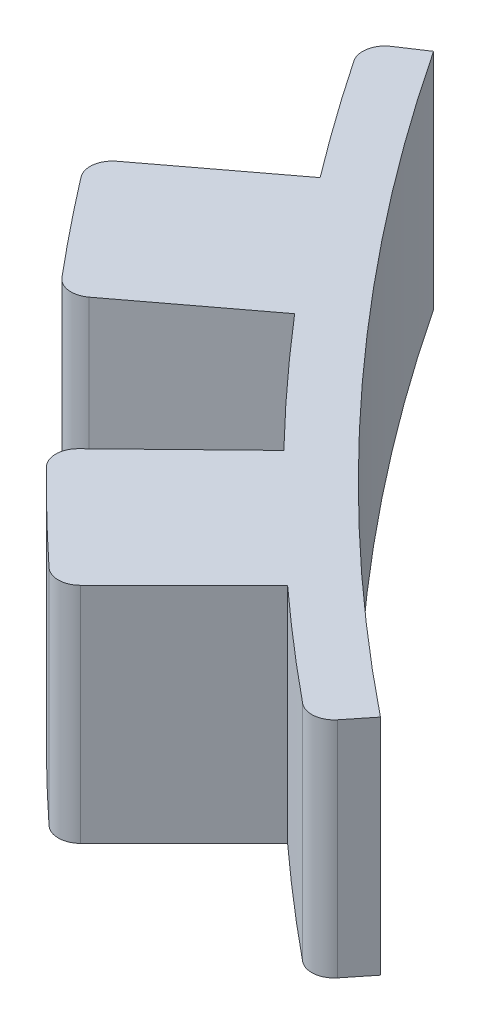
ISO-10303-21;
HEADER;
FILE_DESCRIPTION(('STEP AP214'),'2;1');
FILE_NAME('part.step','',(''),(''),'','','');
FILE_SCHEMA(('AUTOMOTIVE_DESIGN { 1 0 10303 214 1 1 1 1 }'));
ENDSEC;
DATA;
#1=APPLICATION_CONTEXT('core data for automotive mechanical design processes');
#2=APPLICATION_PROTOCOL_DEFINITION('international standard','automotive_design',2000,#1);
#3=PRODUCT_CONTEXT('',#1,'mechanical');
#4=PRODUCT('Part','Part','',(#3));
#5=PRODUCT_RELATED_PRODUCT_CATEGORY('part','',(#4));
#6=PRODUCT_DEFINITION_FORMATION('','',#4);
#7=PRODUCT_DEFINITION_CONTEXT('part definition',#1,'design');
#8=PRODUCT_DEFINITION('design','',#6,#7);
#9=PRODUCT_DEFINITION_SHAPE('','',#8);
#10=(LENGTH_UNIT() NAMED_UNIT(*) SI_UNIT(.MILLI.,.METRE.));
#11=(NAMED_UNIT(*) PLANE_ANGLE_UNIT() SI_UNIT($,.RADIAN.));
#12=(NAMED_UNIT(*) SI_UNIT($,.STERADIAN.) SOLID_ANGLE_UNIT());
#13=UNCERTAINTY_MEASURE_WITH_UNIT(LENGTH_MEASURE(1.E-05),#10,'distance_accuracy_value','');
#14=(GEOMETRIC_REPRESENTATION_CONTEXT(3) GLOBAL_UNCERTAINTY_ASSIGNED_CONTEXT((#13)) GLOBAL_UNIT_ASSIGNED_CONTEXT((#10,
#11,#12)) REPRESENTATION_CONTEXT('',''));
#15=CARTESIAN_POINT('',(0.,0.,0.));
#16=DIRECTION('',(0.,0.,1.));
#17=DIRECTION('',(1.,0.,0.));
#18=AXIS2_PLACEMENT_3D('',#15,#16,#17);
#19=CARTESIAN_POINT('',(-6.27966514113583E-13,25.4,-9.49027582190324E-13));
#20=DIRECTION('',(-0.551826294431821,0.,-0.833959076198374));
#21=DIRECTION('',(-0.833959076198374,0.,0.551826294431821));
#22=AXIS2_PLACEMENT_3D('',#19,#20,#21);
#23=PLANE('',#22);
#24=DIRECTION('',(0.833959076198374,0.,-0.551826294431821));
#25=VECTOR('',#24,1.);
#26=CARTESIAN_POINT('',(-6.27966514113583E-13,0.,-9.49027582190324E-13));
#27=LINE('',#26,#25);
#28=CARTESIAN_POINT('',(-253.722297459853,0.,167.88669758262));
#29=VERTEX_POINT('',#28);
#30=CARTESIAN_POINT('',(-250.832740903124,0.,165.97469334553));
#31=VERTEX_POINT('',#30);
#32=EDGE_CURVE('E211',#29,#31,#27,.T.);
#33=ORIENTED_EDGE('',*,*,#32,.F.);
#34=DIRECTION('',(0.,1.,0.));
#35=VECTOR('',#34,1.);
#36=CARTESIAN_POINT('',(-253.722297459853,25.4,167.88669758262));
#37=LINE('',#36,#35);
#38=CARTESIAN_POINT('',(-253.722297459853,25.4,167.88669758262));
#39=VERTEX_POINT('',#38);
#40=EDGE_CURVE('E11',#29,#39,#37,.T.);
#41=ORIENTED_EDGE('',*,*,#40,.T.);
#42=DIRECTION('',(0.833959076198374,0.,-0.551826294431821));
#43=VECTOR('',#42,1.);
#44=CARTESIAN_POINT('',(-6.27966514113583E-13,25.4,-9.49027582190324E-13));
#45=LINE('',#44,#43);
#46=CARTESIAN_POINT('',(-250.832740903124,25.4,165.97469334553));
#47=VERTEX_POINT('',#46);
#48=EDGE_CURVE('E170',#39,#47,#45,.T.);
#49=ORIENTED_EDGE('',*,*,#48,.T.);
#50=DIRECTION('',(0.,-1.,0.));
#51=VECTOR('',#50,1.);
#52=CARTESIAN_POINT('',(-250.832740903124,25.4,165.97469334553));
#53=LINE('',#52,#51);
#54=EDGE_CURVE('E210',#47,#31,#53,.T.);
#55=ORIENTED_EDGE('',*,*,#54,.T.);
#56=EDGE_LOOP('',(#33,#41,#49,#55));
#57=FACE_BOUND('',#56,.T.);
#58=ADVANCED_FACE('F32',(#57),#23,.T.);
#59=CARTESIAN_POINT('',(0.,25.4,0.));
#60=DIRECTION('',(0.,-1.,0.));
#61=DIRECTION('',(0.,0.,-1.));
#62=AXIS2_PLACEMENT_3D('',#59,#60,#61);
#63=CYLINDRICAL_SURFACE('',#62,306.788909699779);
#64=CARTESIAN_POINT('',(0.,25.4,0.));
#65=DIRECTION('',(0.,1.,0.));
#66=DIRECTION('',(0.,0.,1.));
#67=AXIS2_PLACEMENT_3D('',#64,#65,#66);
#68=CIRCLE('',#67,306.788909699779);
#69=CARTESIAN_POINT('',(-254.427139427044,25.4,171.424227686027));
#70=VERTEX_POINT('',#69);
#71=CARTESIAN_POINT('',(-244.848924973959,25.4,184.847069367832));
#72=VERTEX_POINT('',#71);
#73=EDGE_CURVE('E157',#70,#72,#68,.T.);
#74=ORIENTED_EDGE('',*,*,#73,.F.);
#75=DIRECTION('',(0.,-1.,0.));
#76=VECTOR('',#75,1.);
#77=CARTESIAN_POINT('',(-254.427139427044,25.4,171.424227686027));
#78=LINE('',#77,#76);
#79=CARTESIAN_POINT('',(-254.427139427044,0.,171.424227686027));
#80=VERTEX_POINT('',#79);
#81=EDGE_CURVE('E40',#70,#80,#78,.T.);
#82=ORIENTED_EDGE('',*,*,#81,.T.);
#83=CARTESIAN_POINT('',(0.,0.,0.));
#84=DIRECTION('',(0.,1.,0.));
#85=DIRECTION('',(0.,0.,1.));
#86=AXIS2_PLACEMENT_3D('',#83,#84,#85);
#87=CIRCLE('',#86,306.788909699779);
#88=CARTESIAN_POINT('',(-244.848924973959,0.,184.847069367832));
#89=VERTEX_POINT('',#88);
#90=EDGE_CURVE('E176',#80,#89,#87,.T.);
#91=ORIENTED_EDGE('',*,*,#90,.T.);
#92=DIRECTION('',(0.,-1.,0.));
#93=VECTOR('',#92,1.);
#94=CARTESIAN_POINT('',(-244.848924973959,25.4,184.847069367832));
#95=LINE('',#94,#93);
#96=EDGE_CURVE('E173',#72,#89,#95,.T.);
#97=ORIENTED_EDGE('',*,*,#96,.F.);
#98=EDGE_LOOP('',(#74,#82,#91,#97));
#99=FACE_BOUND('',#98,.T.);
#100=ADVANCED_FACE('F174',(#99),#63,.T.);
#101=CARTESIAN_POINT('',(0.,25.4,0.));
#102=DIRECTION('',(0.602522006250881,0.,0.798102269125589));
#103=DIRECTION('',(0.798102269125589,0.,-0.602522006250881));
#104=AXIS2_PLACEMENT_3D('',#101,#102,#103);
#105=PLANE('',#104);
#106=DIRECTION('',(-0.798102269125589,0.,0.602522006250881));
#107=VECTOR('',#106,1.);
#108=CARTESIAN_POINT('',(0.,0.,0.));
#109=LINE('',#108,#107);
#110=CARTESIAN_POINT('',(-258.016819612122,0.,194.788083950059));
#111=VERTEX_POINT('',#110);
#112=EDGE_CURVE('E214',#89,#111,#109,.T.);
#113=ORIENTED_EDGE('',*,*,#112,.T.);
#114=DIRECTION('',(0.,-1.,0.));
#115=VECTOR('',#114,1.);
#116=CARTESIAN_POINT('',(-258.016819612122,25.4,194.788083950059));
#117=LINE('',#116,#115);
#118=CARTESIAN_POINT('',(-258.016819612122,25.4,194.788083950059));
#119=VERTEX_POINT('',#118);
#120=EDGE_CURVE('E185',#111,#119,#117,.F.);
#121=ORIENTED_EDGE('',*,*,#120,.T.);
#122=DIRECTION('',(-0.798102269125589,0.,0.602522006250881));
#123=VECTOR('',#122,1.);
#124=CARTESIAN_POINT('',(0.,25.4,0.));
#125=LINE('',#124,#123);
#126=EDGE_CURVE('E162',#72,#119,#125,.T.);
#127=ORIENTED_EDGE('',*,*,#126,.F.);
#128=ORIENTED_EDGE('',*,*,#96,.T.);
#129=EDGE_LOOP('',(#113,#121,#127,#128));
#130=FACE_BOUND('',#129,.T.);
#131=ADVANCED_FACE('F183',(#130),#105,.F.);
#132=CARTESIAN_POINT('',(0.,25.4,0.));
#133=DIRECTION('',(0.,-1.,0.));
#134=DIRECTION('',(0.,0.,-1.));
#135=AXIS2_PLACEMENT_3D('',#132,#133,#134);
#136=CYLINDRICAL_SURFACE('',#135,325.837894288981);
#137=CARTESIAN_POINT('',(0.,0.,0.));
#138=DIRECTION('',(0.,1.,0.));
#139=DIRECTION('',(0.,0.,1.));
#140=AXIS2_PLACEMENT_3D('',#137,#138,#139);
#141=CIRCLE('',#140,325.837894288981);
#142=CARTESIAN_POINT('',(-258.501507233238,0.,198.361548977673));
#143=VERTEX_POINT('',#142);
#144=CARTESIAN_POINT('',(-249.693891681859,0.,209.340139035603));
#145=VERTEX_POINT('',#144);
#146=EDGE_CURVE('E216',#143,#145,#141,.T.);
#147=ORIENTED_EDGE('',*,*,#146,.T.);
#148=DIRECTION('',(0.,-1.,0.));
#149=VECTOR('',#148,1.);
#150=CARTESIAN_POINT('',(-249.693891681859,25.4,209.340139035603));
#151=LINE('',#150,#149);
#152=CARTESIAN_POINT('',(-249.693891681859,25.4,209.340139035603));
#153=VERTEX_POINT('',#152);
#154=EDGE_CURVE('E292',#145,#153,#151,.F.);
#155=ORIENTED_EDGE('',*,*,#154,.T.);
#156=CARTESIAN_POINT('',(0.,25.4,0.));
#157=DIRECTION('',(0.,1.,0.));
#158=DIRECTION('',(0.,0.,1.));
#159=AXIS2_PLACEMENT_3D('',#156,#157,#158);
#160=CIRCLE('',#159,325.837894288981);
#161=CARTESIAN_POINT('',(-258.501507233238,25.4,198.361548977673));
#162=VERTEX_POINT('',#161);
#163=EDGE_CURVE('E186',#162,#153,#160,.T.);
#164=ORIENTED_EDGE('',*,*,#163,.F.);
#165=DIRECTION('',(0.,-1.,0.));
#166=VECTOR('',#165,1.);
#167=CARTESIAN_POINT('',(-258.501507233238,25.4,198.361548977673));
#168=LINE('',#167,#166);
#169=EDGE_CURVE('E289',#162,#143,#168,.T.);
#170=ORIENTED_EDGE('',*,*,#169,.T.);
#171=EDGE_LOOP('',(#147,#155,#164,#170));
#172=FACE_BOUND('',#171,.T.);
#173=ADVANCED_FACE('F306',(#172),#136,.T.);
#174=CARTESIAN_POINT('',(11.4715064556953,25.4,15.1951882878898));
#175=DIRECTION('',(-0.602522006250881,0.,-0.798102269125589));
#176=DIRECTION('',(-0.798102269125589,0.,0.602522006250881));
#177=AXIS2_PLACEMENT_3D('',#174,#175,#176);
#178=PLANE('',#177);
#179=DIRECTION('',(0.798102269125589,0.,-0.602522006250881));
#180=VECTOR('',#179,1.);
#181=CARTESIAN_POINT('',(11.4715064556953,25.4,15.1951882878898));
#182=LINE('',#181,#180);
#183=CARTESIAN_POINT('',(-246.217050162661,25.4,209.735452271469));
#184=VERTEX_POINT('',#183);
#185=CARTESIAN_POINT('',(-232.9054611861,25.4,199.685956603036));
#186=VERTEX_POINT('',#185);
#187=EDGE_CURVE('E189',#184,#186,#182,.T.);
#188=ORIENTED_EDGE('',*,*,#187,.F.);
#189=DIRECTION('',(0.,-1.,0.));
#190=VECTOR('',#189,1.);
#191=CARTESIAN_POINT('',(-246.217050162661,25.4,209.735452271469));
#192=LINE('',#191,#190);
#193=CARTESIAN_POINT('',(-246.217050162661,0.,209.735452271469));
#194=VERTEX_POINT('',#193);
#195=EDGE_CURVE('E286',#184,#194,#192,.T.);
#196=ORIENTED_EDGE('',*,*,#195,.T.);
#197=DIRECTION('',(0.798102269125589,0.,-0.602522006250881));
#198=VECTOR('',#197,1.);
#199=CARTESIAN_POINT('',(11.4715064556953,0.,15.1951882878898));
#200=LINE('',#199,#198);
#201=CARTESIAN_POINT('',(-232.9054611861,0.,199.685956603036));
#202=VERTEX_POINT('',#201);
#203=EDGE_CURVE('E219',#194,#202,#200,.T.);
#204=ORIENTED_EDGE('',*,*,#203,.T.);
#205=DIRECTION('',(0.,-1.,0.));
#206=VECTOR('',#205,1.);
#207=CARTESIAN_POINT('',(-232.9054611861,25.4,199.685956603036));
#208=LINE('',#207,#206);
#209=EDGE_CURVE('E181',#186,#202,#208,.T.);
#210=ORIENTED_EDGE('',*,*,#209,.F.);
#211=EDGE_LOOP('',(#188,#196,#204,#210));
#212=FACE_BOUND('',#211,.T.);
#213=ADVANCED_FACE('F314',(#212),#178,.F.);
#214=CARTESIAN_POINT('',(0.,25.4,0.));
#215=DIRECTION('',(0.,-1.,0.));
#216=DIRECTION('',(0.,0.,-1.));
#217=AXIS2_PLACEMENT_3D('',#214,#215,#216);
#218=CYLINDRICAL_SURFACE('',#217,306.788909699779);
#219=CARTESIAN_POINT('',(0.,0.,0.));
#220=DIRECTION('',(0.,1.,0.));
#221=DIRECTION('',(0.,0.,1.));
#222=AXIS2_PLACEMENT_3D('',#219,#220,#221);
#223=CIRCLE('',#222,306.788909699779);
#224=CARTESIAN_POINT('',(-220.065095537838,0.,213.754038185719));
#225=VERTEX_POINT('',#224);
#226=EDGE_CURVE('E221',#202,#225,#223,.T.);
#227=ORIENTED_EDGE('',*,*,#226,.T.);
#228=DIRECTION('',(0.,-1.,0.));
#229=VECTOR('',#228,1.);
#230=CARTESIAN_POINT('',(-220.065095537838,25.4,213.754038185719));
#231=LINE('',#230,#229);
#232=CARTESIAN_POINT('',(-220.065095537838,25.4,213.754038185719));
#233=VERTEX_POINT('',#232);
#234=EDGE_CURVE('E246',#233,#225,#231,.T.);
#235=ORIENTED_EDGE('',*,*,#234,.F.);
#236=CARTESIAN_POINT('',(0.,25.4,0.));
#237=DIRECTION('',(0.,1.,0.));
#238=DIRECTION('',(0.,0.,1.));
#239=AXIS2_PLACEMENT_3D('',#236,#237,#238);
#240=CIRCLE('',#239,306.788909699779);
#241=EDGE_CURVE('E194',#186,#233,#240,.T.);
#242=ORIENTED_EDGE('',*,*,#241,.F.);
#243=ORIENTED_EDGE('',*,*,#209,.T.);
#244=EDGE_LOOP('',(#227,#235,#242,#243));
#245=FACE_BOUND('',#244,.T.);
#246=ADVANCED_FACE('F320',(#245),#218,.T.);
#247=CARTESIAN_POINT('',(-1.74047351914841E-13,25.4,-1.79186075043732E-13));
#248=DIRECTION('',(0.696746301536442,0.,0.717317636263942));
#249=DIRECTION('',(0.717317636263942,0.,-0.696746301536442));
#250=AXIS2_PLACEMENT_3D('',#247,#248,#249);
#251=PLANE('',#250);
#252=DIRECTION('',(-0.717317636263942,0.,0.696746301536442));
#253=VECTOR('',#252,1.);
#254=CARTESIAN_POINT('',(-1.74047351914841E-13,0.,-1.79186075043732E-13));
#255=LINE('',#254,#253);
#256=CARTESIAN_POINT('',(-231.90012398196,0.,225.249660041566));
#257=VERTEX_POINT('',#256);
#258=EDGE_CURVE('E223',#225,#257,#255,.T.);
#259=ORIENTED_EDGE('',*,*,#258,.T.);
#260=DIRECTION('',(0.,-1.,0.));
#261=VECTOR('',#260,1.);
#262=CARTESIAN_POINT('',(-231.90012398196,25.4,225.249660041566));
#263=LINE('',#262,#261);
#264=CARTESIAN_POINT('',(-231.90012398196,25.4,225.249660041566));
#265=VERTEX_POINT('',#264);
#266=EDGE_CURVE('E284',#257,#265,#263,.F.);
#267=ORIENTED_EDGE('',*,*,#266,.T.);
#268=DIRECTION('',(-0.717317636263942,0.,0.696746301536442));
#269=VECTOR('',#268,1.);
#270=CARTESIAN_POINT('',(-1.74047351914841E-13,25.4,-1.79186075043732E-13));
#271=LINE('',#270,#269);
#272=EDGE_CURVE('E196',#233,#265,#271,.T.);
#273=ORIENTED_EDGE('',*,*,#272,.F.);
#274=ORIENTED_EDGE('',*,*,#234,.T.);
#275=EDGE_LOOP('',(#259,#267,#273,#274));
#276=FACE_BOUND('',#275,.T.);
#277=ADVANCED_FACE('F462',(#276),#251,.F.);
#278=CARTESIAN_POINT('',(0.,25.4,0.));
#279=DIRECTION('',(0.,-1.,0.));
#280=DIRECTION('',(0.,0.,-1.));
#281=AXIS2_PLACEMENT_3D('',#278,#279,#280);
#282=CYLINDRICAL_SURFACE('',#281,325.837894288981);
#283=CARTESIAN_POINT('',(0.,0.,0.));
#284=DIRECTION('',(0.,1.,0.));
#285=DIRECTION('',(0.,0.,1.));
#286=AXIS2_PLACEMENT_3D('',#283,#284,#285);
#287=CIRCLE('',#286,325.837894288981);
#288=CARTESIAN_POINT('',(-231.938414957117,0.,228.855642320345));
#289=VERTEX_POINT('',#288);
#290=CARTESIAN_POINT('',(-221.864697377229,0.,238.634426293417));
#291=VERTEX_POINT('',#290);
#292=EDGE_CURVE('E226',#289,#291,#287,.T.);
#293=ORIENTED_EDGE('',*,*,#292,.T.);
#294=DIRECTION('',(0.,-1.,0.));
#295=VECTOR('',#294,1.);
#296=CARTESIAN_POINT('',(-221.864697377229,25.4,238.634426293417));
#297=LINE('',#296,#295);
#298=CARTESIAN_POINT('',(-221.864697377229,25.4,238.634426293417));
#299=VERTEX_POINT('',#298);
#300=EDGE_CURVE('E55',#291,#299,#297,.F.);
#301=ORIENTED_EDGE('',*,*,#300,.T.);
#302=CARTESIAN_POINT('',(0.,25.4,0.));
#303=DIRECTION('',(0.,1.,0.));
#304=DIRECTION('',(0.,0.,1.));
#305=AXIS2_PLACEMENT_3D('',#302,#303,#304);
#306=CIRCLE('',#305,325.837894288981);
#307=CARTESIAN_POINT('',(-231.938414957117,25.4,228.855642320345));
#308=VERTEX_POINT('',#307);
#309=EDGE_CURVE('E199',#308,#299,#306,.T.);
#310=ORIENTED_EDGE('',*,*,#309,.F.);
#311=DIRECTION('',(0.,-1.,0.));
#312=VECTOR('',#311,1.);
#313=CARTESIAN_POINT('',(-231.938414957117,25.4,228.855642320345));
#314=LINE('',#313,#312);
#315=EDGE_CURVE('E280',#308,#289,#314,.T.);
#316=ORIENTED_EDGE('',*,*,#315,.T.);
#317=EDGE_LOOP('',(#293,#301,#310,#316));
#318=FACE_BOUND('',#317,.T.);
#319=ADVANCED_FACE('F329',(#318),#282,.T.);
#320=CARTESIAN_POINT('',(10.1155532550883,25.4,10.1155532551089));
#321=DIRECTION('',(-0.707106781185825,0.,-0.70710678118727));
#322=DIRECTION('',(-0.70710678118727,0.,0.707106781185825));
#323=AXIS2_PLACEMENT_3D('',#320,#321,#322);
#324=PLANE('',#323);
#325=DIRECTION('',(0.70710678118727,0.,-0.707106781185825));
#326=VECTOR('',#325,1.);
#327=CARTESIAN_POINT('',(10.1155532550883,25.4,10.1155532551089));
#328=LINE('',#327,#326);
#329=CARTESIAN_POINT('',(-218.339147094695,25.4,238.570253604426));
#330=VERTEX_POINT('',#329);
#331=CARTESIAN_POINT('',(-206.580992956034,25.4,226.812099465788));
#332=VERTEX_POINT('',#331);
#333=EDGE_CURVE('E201',#330,#332,#328,.T.);
#334=ORIENTED_EDGE('',*,*,#333,.F.);
#335=DIRECTION('',(0.,-1.,0.));
#336=VECTOR('',#335,1.);
#337=CARTESIAN_POINT('',(-218.339147094695,25.4,238.570253604426));
#338=LINE('',#337,#336);
#339=CARTESIAN_POINT('',(-218.339147094695,0.,238.570253604426));
#340=VERTEX_POINT('',#339);
#341=EDGE_CURVE('E277',#330,#340,#338,.T.);
#342=ORIENTED_EDGE('',*,*,#341,.T.);
#343=DIRECTION('',(0.70710678118727,0.,-0.707106781185825));
#344=VECTOR('',#343,1.);
#345=CARTESIAN_POINT('',(10.1155532550883,0.,10.1155532551089));
#346=LINE('',#345,#344);
#347=CARTESIAN_POINT('',(-206.580992956034,0.,226.812099465788));
#348=VERTEX_POINT('',#347);
#349=EDGE_CURVE('E228',#340,#348,#346,.T.);
#350=ORIENTED_EDGE('',*,*,#349,.T.);
#351=DIRECTION('',(0.,-1.,0.));
#352=VECTOR('',#351,1.);
#353=CARTESIAN_POINT('',(-206.580992956034,25.4,226.812099465788));
#354=LINE('',#353,#352);
#355=EDGE_CURVE('E243',#332,#348,#354,.T.);
#356=ORIENTED_EDGE('',*,*,#355,.F.);
#357=EDGE_LOOP('',(#334,#342,#350,#356));
#358=FACE_BOUND('',#357,.T.);
#359=ADVANCED_FACE('F337',(#358),#324,.F.);
#360=CARTESIAN_POINT('',(0.,25.4,0.));
#361=DIRECTION('',(0.,-1.,0.));
#362=DIRECTION('',(0.,0.,-1.));
#363=AXIS2_PLACEMENT_3D('',#360,#361,#362);
#364=CYLINDRICAL_SURFACE('',#363,306.788909699779);
#365=CARTESIAN_POINT('',(0.,0.,0.));
#366=DIRECTION('',(0.,1.,0.));
#367=DIRECTION('',(0.,0.,1.));
#368=AXIS2_PLACEMENT_3D('',#365,#366,#367);
#369=CIRCLE('',#368,306.788909699779);
#370=CARTESIAN_POINT('',(-194.095881709627,0.,237.584140502143));
#371=VERTEX_POINT('',#370);
#372=EDGE_CURVE('E230',#348,#371,#369,.T.);
#373=ORIENTED_EDGE('',*,*,#372,.T.);
#374=DIRECTION('',(0.,-1.,0.));
#375=VECTOR('',#374,1.);
#376=CARTESIAN_POINT('',(-194.095881709627,25.4,237.584140502143));
#377=LINE('',#376,#375);
#378=CARTESIAN_POINT('',(-194.095881709627,25.4,237.584140502143));
#379=VERTEX_POINT('',#378);
#380=EDGE_CURVE('E265',#371,#379,#377,.F.);
#381=ORIENTED_EDGE('',*,*,#380,.T.);
#382=CARTESIAN_POINT('',(0.,25.4,0.));
#383=DIRECTION('',(0.,1.,0.));
#384=DIRECTION('',(0.,0.,1.));
#385=AXIS2_PLACEMENT_3D('',#382,#383,#384);
#386=CIRCLE('',#385,306.788909699779);
#387=EDGE_CURVE('E203',#332,#379,#386,.T.);
#388=ORIENTED_EDGE('',*,*,#387,.F.);
#389=ORIENTED_EDGE('',*,*,#355,.T.);
#390=EDGE_LOOP('',(#373,#381,#388,#389));
#391=FACE_BOUND('',#390,.T.);
#392=ADVANCED_FACE('F435',(#391),#364,.T.);
#393=CARTESIAN_POINT('',(0.,25.4,0.));
#394=DIRECTION('',(-0.779676998917513,0.,-0.626181904368834));
#395=DIRECTION('',(-0.626181904368834,0.,0.779676998917513));
#396=AXIS2_PLACEMENT_3D('',#393,#394,#395);
#397=PLANE('',#396);
#398=DIRECTION('',(0.626181904368834,0.,-0.779676998917513));
#399=VECTOR('',#398,1.);
#400=CARTESIAN_POINT('',(0.,25.4,0.));
#401=LINE('',#400,#399);
#402=CARTESIAN_POINT('',(-190.5085224667,25.4,237.207610166831));
#403=VERTEX_POINT('',#402);
#404=CARTESIAN_POINT('',(-188.338885995181,25.4,234.506133741126));
#405=VERTEX_POINT('',#404);
#406=EDGE_CURVE('E205',#403,#405,#401,.T.);
#407=ORIENTED_EDGE('',*,*,#406,.F.);
#408=DIRECTION('',(0.,-1.,0.));
#409=VECTOR('',#408,1.);
#410=CARTESIAN_POINT('',(-190.5085224667,25.4,237.207610166831));
#411=LINE('',#410,#409);
#412=CARTESIAN_POINT('',(-190.5085224667,0.,237.207610166831));
#413=VERTEX_POINT('',#412);
#414=EDGE_CURVE('E180',#403,#413,#411,.T.);
#415=ORIENTED_EDGE('',*,*,#414,.T.);
#416=DIRECTION('',(0.626181904368834,0.,-0.779676998917513));
#417=VECTOR('',#416,1.);
#418=CARTESIAN_POINT('',(0.,0.,0.));
#419=LINE('',#418,#417);
#420=CARTESIAN_POINT('',(-188.338885995181,0.,234.506133741126));
#421=VERTEX_POINT('',#420);
#422=EDGE_CURVE('E233',#413,#421,#419,.T.);
#423=ORIENTED_EDGE('',*,*,#422,.T.);
#424=DIRECTION('',(0.,-1.,0.));
#425=VECTOR('',#424,1.);
#426=CARTESIAN_POINT('',(-188.338885995181,25.4,234.506133741126));
#427=LINE('',#426,#425);
#428=EDGE_CURVE('E240',#405,#421,#427,.T.);
#429=ORIENTED_EDGE('',*,*,#428,.F.);
#430=EDGE_LOOP('',(#407,#415,#423,#429));
#431=FACE_BOUND('',#430,.T.);
#432=ADVANCED_FACE('F348',(#431),#397,.F.);
#433=CARTESIAN_POINT('',(0.,25.4,0.));
#434=DIRECTION('',(0.,-1.,0.));
#435=DIRECTION('',(0.,0.,-1.));
#436=AXIS2_PLACEMENT_3D('',#433,#434,#435);
#437=CYLINDRICAL_SURFACE('',#436,300.773440882198);
#438=CARTESIAN_POINT('',(0.,0.,0.));
#439=DIRECTION('',(0.,1.,0.));
#440=DIRECTION('',(0.,0.,1.));
#441=AXIS2_PLACEMENT_3D('',#438,#439,#440);
#442=CIRCLE('',#441,300.773440882198);
#443=EDGE_CURVE('E235',#31,#421,#442,.T.);
#444=ORIENTED_EDGE('',*,*,#443,.F.);
#445=ORIENTED_EDGE('',*,*,#54,.F.);
#446=CARTESIAN_POINT('',(0.,25.4,0.));
#447=DIRECTION('',(0.,1.,0.));
#448=DIRECTION('',(0.,0.,1.));
#449=AXIS2_PLACEMENT_3D('',#446,#447,#448);
#450=CIRCLE('',#449,300.773440882198);
#451=EDGE_CURVE('E207',#47,#405,#450,.T.);
#452=ORIENTED_EDGE('',*,*,#451,.T.);
#453=ORIENTED_EDGE('',*,*,#428,.T.);
#454=EDGE_LOOP('',(#444,#445,#452,#453));
#455=FACE_BOUND('',#454,.T.);
#456=ADVANCED_FACE('F353',(#455),#437,.F.);
#457=CARTESIAN_POINT('',(0.,25.4,0.));
#458=DIRECTION('',(0.,1.,0.));
#459=DIRECTION('',(0.,0.,1.));
#460=AXIS2_PLACEMENT_3D('',#457,#458,#459);
#461=PLANE('',#460);
#462=ORIENTED_EDGE('',*,*,#387,.T.);
#463=CARTESIAN_POINT('',(-192.488902043951,25.4,235.617108129734));
#464=DIRECTION('',(0.,1.,0.));
#465=DIRECTION('',(0.,0.,1.));
#466=AXIS2_PLACEMENT_3D('',#463,#464,#465);
#467=CIRCLE('',#466,2.54);
#468=EDGE_CURVE('E275',#379,#403,#467,.T.);
#469=ORIENTED_EDGE('',*,*,#468,.T.);
#470=ORIENTED_EDGE('',*,*,#406,.T.);
#471=ORIENTED_EDGE('',*,*,#451,.F.);
#472=ORIENTED_EDGE('',*,*,#48,.F.);
#473=CARTESIAN_POINT('',(-252.320658671997,25.4,170.004953636164));
#474=DIRECTION('',(0.,1.,0.));
#475=DIRECTION('',(0.,0.,1.));
#476=AXIS2_PLACEMENT_3D('',#473,#474,#475);
#477=CIRCLE('',#476,2.54);
#478=EDGE_CURVE('E166',#39,#70,#477,.T.);
#479=ORIENTED_EDGE('',*,*,#478,.T.);
#480=ORIENTED_EDGE('',*,*,#73,.T.);
#481=ORIENTED_EDGE('',*,*,#126,.T.);
#482=CARTESIAN_POINT('',(-256.486413716245,25.4,196.815263713638));
#483=DIRECTION('',(0.,1.,0.));
#484=DIRECTION('',(0.,0.,1.));
#485=AXIS2_PLACEMENT_3D('',#482,#483,#484);
#486=CIRCLE('',#485,2.54);
#487=EDGE_CURVE('E268',#119,#162,#486,.T.);
#488=ORIENTED_EDGE('',*,*,#487,.T.);
#489=ORIENTED_EDGE('',*,*,#163,.T.);
#490=CARTESIAN_POINT('',(-247.747456058538,25.4,207.70827250789));
#491=DIRECTION('',(0.,1.,0.));
#492=DIRECTION('',(0.,0.,1.));
#493=AXIS2_PLACEMENT_3D('',#490,#491,#492);
#494=CIRCLE('',#493,2.54);
#495=EDGE_CURVE('E270',#153,#184,#494,.T.);
#496=ORIENTED_EDGE('',*,*,#495,.T.);
#497=ORIENTED_EDGE('',*,*,#187,.T.);
#498=ORIENTED_EDGE('',*,*,#241,.T.);
#499=ORIENTED_EDGE('',*,*,#272,.T.);
#500=CARTESIAN_POINT('',(-230.130388376057,25.4,227.071646837676));
#501=DIRECTION('',(0.,1.,0.));
#502=DIRECTION('',(0.,0.,1.));
#503=AXIS2_PLACEMENT_3D('',#500,#501,#502);
#504=CIRCLE('',#503,2.54);
#505=EDGE_CURVE('E272',#265,#308,#504,.T.);
#506=ORIENTED_EDGE('',*,*,#505,.T.);
#507=ORIENTED_EDGE('',*,*,#309,.T.);
#508=CARTESIAN_POINT('',(-220.135198318907,25.4,236.77420238021));
#509=DIRECTION('',(0.,1.,0.));
#510=DIRECTION('',(0.,0.,1.));
#511=AXIS2_PLACEMENT_3D('',#508,#509,#510);
#512=CIRCLE('',#511,2.54);
#513=EDGE_CURVE('E47',#299,#330,#512,.T.);
#514=ORIENTED_EDGE('',*,*,#513,.T.);
#515=ORIENTED_EDGE('',*,*,#333,.T.);
#516=EDGE_LOOP('',(#462,#469,#470,#471,#472,#479,#480,#481,#488,#489,#496,#497,#498,#499,#506,
#507,#514,#515));
#517=FACE_BOUND('',#516,.T.);
#518=ADVANCED_FACE('F160',(#517),#461,.T.);
#519=CARTESIAN_POINT('',(0.,0.,0.));
#520=DIRECTION('',(0.,1.,0.));
#521=DIRECTION('',(0.,0.,1.));
#522=AXIS2_PLACEMENT_3D('',#519,#520,#521);
#523=PLANE('',#522);
#524=ORIENTED_EDGE('',*,*,#422,.F.);
#525=CARTESIAN_POINT('',(-192.488902043951,0.,235.617108129734));
#526=DIRECTION('',(0.,1.,0.));
#527=DIRECTION('',(0.,0.,1.));
#528=AXIS2_PLACEMENT_3D('',#525,#526,#527);
#529=CIRCLE('',#528,2.54);
#530=EDGE_CURVE('E263',#413,#371,#529,.F.);
#531=ORIENTED_EDGE('',*,*,#530,.T.);
#532=ORIENTED_EDGE('',*,*,#372,.F.);
#533=ORIENTED_EDGE('',*,*,#349,.F.);
#534=CARTESIAN_POINT('',(-220.135198318907,0.,236.77420238021));
#535=DIRECTION('',(0.,1.,0.));
#536=DIRECTION('',(0.,0.,1.));
#537=AXIS2_PLACEMENT_3D('',#534,#535,#536);
#538=CIRCLE('',#537,2.54);
#539=EDGE_CURVE('E261',#340,#291,#538,.F.);
#540=ORIENTED_EDGE('',*,*,#539,.T.);
#541=ORIENTED_EDGE('',*,*,#292,.F.);
#542=CARTESIAN_POINT('',(-230.130388376057,0.,227.071646837676));
#543=DIRECTION('',(0.,1.,0.));
#544=DIRECTION('',(0.,0.,1.));
#545=AXIS2_PLACEMENT_3D('',#542,#543,#544);
#546=CIRCLE('',#545,2.54);
#547=EDGE_CURVE('E259',#289,#257,#546,.F.);
#548=ORIENTED_EDGE('',*,*,#547,.T.);
#549=ORIENTED_EDGE('',*,*,#258,.F.);
#550=ORIENTED_EDGE('',*,*,#226,.F.);
#551=ORIENTED_EDGE('',*,*,#203,.F.);
#552=CARTESIAN_POINT('',(-247.747456058538,0.,207.70827250789));
#553=DIRECTION('',(0.,1.,0.));
#554=DIRECTION('',(0.,0.,1.));
#555=AXIS2_PLACEMENT_3D('',#552,#553,#554);
#556=CIRCLE('',#555,2.54);
#557=EDGE_CURVE('E257',#194,#145,#556,.F.);
#558=ORIENTED_EDGE('',*,*,#557,.T.);
#559=ORIENTED_EDGE('',*,*,#146,.F.);
#560=CARTESIAN_POINT('',(-256.486413716245,0.,196.815263713638));
#561=DIRECTION('',(0.,1.,0.));
#562=DIRECTION('',(0.,0.,1.));
#563=AXIS2_PLACEMENT_3D('',#560,#561,#562);
#564=CIRCLE('',#563,2.54);
#565=EDGE_CURVE('E255',#143,#111,#564,.F.);
#566=ORIENTED_EDGE('',*,*,#565,.T.);
#567=ORIENTED_EDGE('',*,*,#112,.F.);
#568=ORIENTED_EDGE('',*,*,#90,.F.);
#569=CARTESIAN_POINT('',(-252.320658671997,0.,170.004953636164));
#570=DIRECTION('',(0.,1.,0.));
#571=DIRECTION('',(0.,0.,1.));
#572=AXIS2_PLACEMENT_3D('',#569,#570,#571);
#573=CIRCLE('',#572,2.54);
#574=EDGE_CURVE('E253',#80,#29,#573,.F.);
#575=ORIENTED_EDGE('',*,*,#574,.T.);
#576=ORIENTED_EDGE('',*,*,#32,.T.);
#577=ORIENTED_EDGE('',*,*,#443,.T.);
#578=EDGE_LOOP('',(#524,#531,#532,#533,#540,#541,#548,#549,#550,#551,#558,#559,#566,#567,#568,
#575,#576,#577));
#579=FACE_BOUND('',#578,.T.);
#580=ADVANCED_FACE('F297',(#579),#523,.F.);
#581=CARTESIAN_POINT('',(-192.488902043951,25.4,235.617108129734));
#582=DIRECTION('',(0.,-1.,0.));
#583=DIRECTION('',(0.,0.,-1.));
#584=AXIS2_PLACEMENT_3D('',#581,#582,#583);
#585=CYLINDRICAL_SURFACE('',#584,2.54);
#586=ORIENTED_EDGE('',*,*,#468,.F.);
#587=ORIENTED_EDGE('',*,*,#380,.F.);
#588=ORIENTED_EDGE('',*,*,#530,.F.);
#589=ORIENTED_EDGE('',*,*,#414,.F.);
#590=EDGE_LOOP('',(#586,#587,#588,#589));
#591=FACE_BOUND('',#590,.T.);
#592=ADVANCED_FACE('F346',(#591),#585,.T.);
#593=CARTESIAN_POINT('',(-220.135198318907,25.4,236.77420238021));
#594=DIRECTION('',(0.,-1.,0.));
#595=DIRECTION('',(0.,0.,-1.));
#596=AXIS2_PLACEMENT_3D('',#593,#594,#595);
#597=CYLINDRICAL_SURFACE('',#596,2.54);
#598=ORIENTED_EDGE('',*,*,#513,.F.);
#599=ORIENTED_EDGE('',*,*,#300,.F.);
#600=ORIENTED_EDGE('',*,*,#539,.F.);
#601=ORIENTED_EDGE('',*,*,#341,.F.);
#602=EDGE_LOOP('',(#598,#599,#600,#601));
#603=FACE_BOUND('',#602,.T.);
#604=ADVANCED_FACE('F335',(#603),#597,.T.);
#605=CARTESIAN_POINT('',(-230.130388376057,25.4,227.071646837676));
#606=DIRECTION('',(0.,-1.,0.));
#607=DIRECTION('',(0.,0.,-1.));
#608=AXIS2_PLACEMENT_3D('',#605,#606,#607);
#609=CYLINDRICAL_SURFACE('',#608,2.54);
#610=ORIENTED_EDGE('',*,*,#505,.F.);
#611=ORIENTED_EDGE('',*,*,#266,.F.);
#612=ORIENTED_EDGE('',*,*,#547,.F.);
#613=ORIENTED_EDGE('',*,*,#315,.F.);
#614=EDGE_LOOP('',(#610,#611,#612,#613));
#615=FACE_BOUND('',#614,.T.);
#616=ADVANCED_FACE('F327',(#615),#609,.T.);
#617=CARTESIAN_POINT('',(-247.747456058538,25.4,207.70827250789));
#618=DIRECTION('',(0.,-1.,0.));
#619=DIRECTION('',(0.,0.,-1.));
#620=AXIS2_PLACEMENT_3D('',#617,#618,#619);
#621=CYLINDRICAL_SURFACE('',#620,2.54);
#622=ORIENTED_EDGE('',*,*,#495,.F.);
#623=ORIENTED_EDGE('',*,*,#154,.F.);
#624=ORIENTED_EDGE('',*,*,#557,.F.);
#625=ORIENTED_EDGE('',*,*,#195,.F.);
#626=EDGE_LOOP('',(#622,#623,#624,#625));
#627=FACE_BOUND('',#626,.T.);
#628=ADVANCED_FACE('F309',(#627),#621,.T.);
#629=CARTESIAN_POINT('',(-256.486413716245,25.4,196.815263713638));
#630=DIRECTION('',(0.,-1.,0.));
#631=DIRECTION('',(0.,0.,-1.));
#632=AXIS2_PLACEMENT_3D('',#629,#630,#631);
#633=CYLINDRICAL_SURFACE('',#632,2.54);
#634=ORIENTED_EDGE('',*,*,#487,.F.);
#635=ORIENTED_EDGE('',*,*,#120,.F.);
#636=ORIENTED_EDGE('',*,*,#565,.F.);
#637=ORIENTED_EDGE('',*,*,#169,.F.);
#638=EDGE_LOOP('',(#634,#635,#636,#637));
#639=FACE_BOUND('',#638,.T.);
#640=ADVANCED_FACE('F301',(#639),#633,.T.);
#641=CARTESIAN_POINT('',(-252.320658671997,25.4,170.004953636164));
#642=DIRECTION('',(0.,-1.,0.));
#643=DIRECTION('',(0.,0.,-1.));
#644=AXIS2_PLACEMENT_3D('',#641,#642,#643);
#645=CYLINDRICAL_SURFACE('',#644,2.54);
#646=ORIENTED_EDGE('',*,*,#478,.F.);
#647=ORIENTED_EDGE('',*,*,#40,.F.);
#648=ORIENTED_EDGE('',*,*,#574,.F.);
#649=ORIENTED_EDGE('',*,*,#81,.F.);
#650=EDGE_LOOP('',(#646,#647,#648,#649));
#651=FACE_BOUND('',#650,.T.);
#652=ADVANCED_FACE('F34',(#651),#645,.T.);
#653=CLOSED_SHELL('',(#58,#100,#131,#173,#213,#246,#277,#319,#359,#392,#432,#456,#518,#580,#592,
#604,#616,#628,#640,#652));
#654=MANIFOLD_SOLID_BREP('B2',#653);
#655=ADVANCED_BREP_SHAPE_REPRESENTATION('',(#18,#654),#14);
#656=SHAPE_DEFINITION_REPRESENTATION(#9,#655);
ENDSEC;
END-ISO-10303-21;
